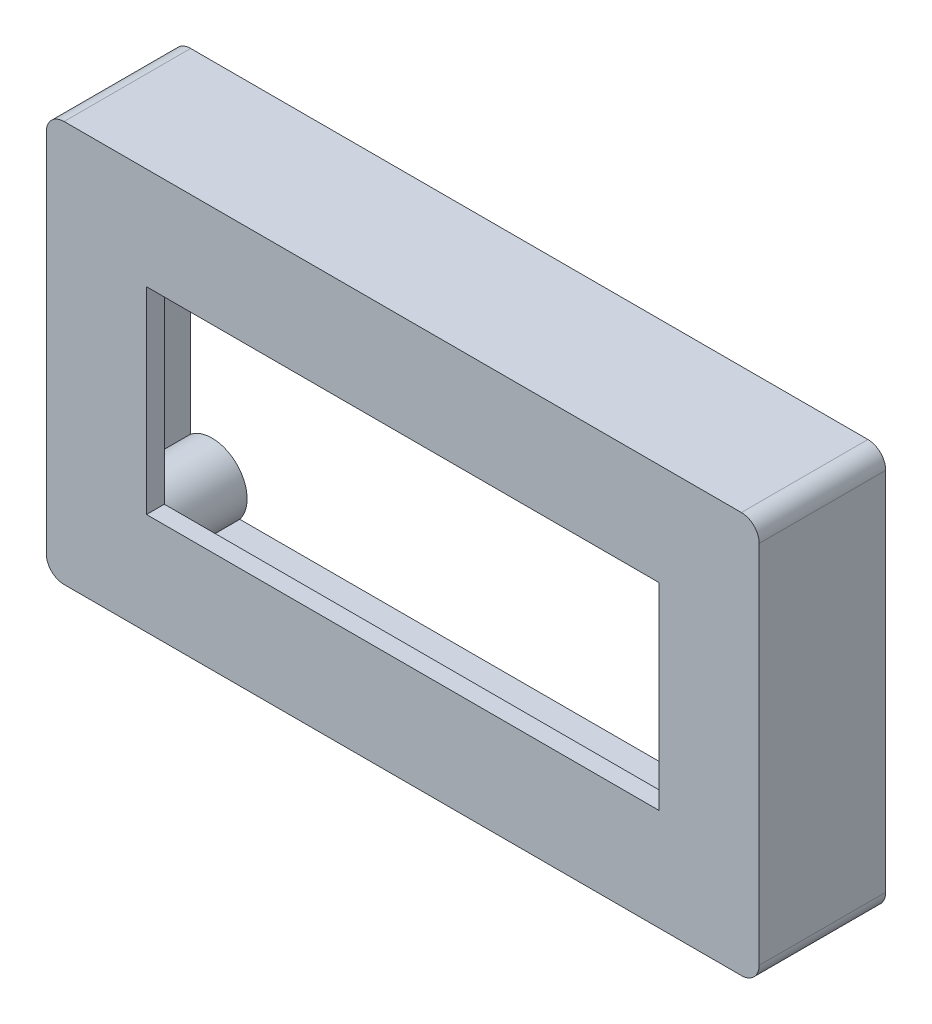
ISO-10303-21;
HEADER;
FILE_DESCRIPTION(('STEP AP214'),'2;1');
FILE_NAME('part.step','',(''),(''),'','','');
FILE_SCHEMA(('AUTOMOTIVE_DESIGN { 1 0 10303 214 1 1 1 1 }'));
ENDSEC;
DATA;
#1=APPLICATION_CONTEXT('core data for automotive mechanical design processes');
#2=APPLICATION_PROTOCOL_DEFINITION('international standard','automotive_design',2000,#1);
#3=PRODUCT_CONTEXT('',#1,'mechanical');
#4=PRODUCT('Part','Part','',(#3));
#5=PRODUCT_RELATED_PRODUCT_CATEGORY('part','',(#4));
#6=PRODUCT_DEFINITION_FORMATION('','',#4);
#7=PRODUCT_DEFINITION_CONTEXT('part definition',#1,'design');
#8=PRODUCT_DEFINITION('design','',#6,#7);
#9=PRODUCT_DEFINITION_SHAPE('','',#8);
#10=(LENGTH_UNIT() NAMED_UNIT(*) SI_UNIT(.MILLI.,.METRE.));
#11=(NAMED_UNIT(*) PLANE_ANGLE_UNIT() SI_UNIT($,.RADIAN.));
#12=(NAMED_UNIT(*) SI_UNIT($,.STERADIAN.) SOLID_ANGLE_UNIT());
#13=UNCERTAINTY_MEASURE_WITH_UNIT(LENGTH_MEASURE(1.E-05),#10,'distance_accuracy_value','');
#14=(GEOMETRIC_REPRESENTATION_CONTEXT(3) GLOBAL_UNCERTAINTY_ASSIGNED_CONTEXT((#13)) GLOBAL_UNIT_ASSIGNED_CONTEXT((#10,
#11,#12)) REPRESENTATION_CONTEXT('',''));
#15=CARTESIAN_POINT('',(0.,0.,0.));
#16=DIRECTION('',(0.,0.,1.));
#17=DIRECTION('',(1.,0.,0.));
#18=AXIS2_PLACEMENT_3D('',#15,#16,#17);
#19=CARTESIAN_POINT('',(-48.26,26.035,15.494));
#20=DIRECTION('',(1.,0.,0.));
#21=DIRECTION('',(0.,1.,0.));
#22=AXIS2_PLACEMENT_3D('',#19,#20,#21);
#23=PLANE('',#22);
#24=DIRECTION('',(0.,-1.,0.));
#25=VECTOR('',#24,1.);
#26=CARTESIAN_POINT('',(-48.26,26.035,15.494));
#27=LINE('',#26,#25);
#28=CARTESIAN_POINT('',(-48.26,19.0234541127924,15.494));
#29=VERTEX_POINT('',#28);
#30=CARTESIAN_POINT('',(-48.26,-19.0234541127924,15.494));
#31=VERTEX_POINT('',#30);
#32=EDGE_CURVE('E190',#29,#31,#27,.T.);
#33=ORIENTED_EDGE('',*,*,#32,.T.);
#34=DIRECTION('',(0.,0.,1.));
#35=VECTOR('',#34,1.);
#36=CARTESIAN_POINT('',(-48.26,-19.0234541127924,-14.1421356237309));
#37=LINE('',#36,#35);
#38=CARTESIAN_POINT('',(-48.26,-19.0234541127924,0.));
#39=VERTEX_POINT('',#38);
#40=EDGE_CURVE('E199',#31,#39,#37,.F.);
#41=ORIENTED_EDGE('',*,*,#40,.T.);
#42=DIRECTION('',(0.,-1.,0.));
#43=VECTOR('',#42,1.);
#44=CARTESIAN_POINT('',(-48.26,26.035,0.));
#45=LINE('',#44,#43);
#46=CARTESIAN_POINT('',(-48.26,19.0234541127924,0.));
#47=VERTEX_POINT('',#46);
#48=EDGE_CURVE('E287',#47,#39,#45,.T.);
#49=ORIENTED_EDGE('',*,*,#48,.F.);
#50=DIRECTION('',(0.,0.,1.));
#51=VECTOR('',#50,1.);
#52=CARTESIAN_POINT('',(-48.26,19.0234541127924,-14.1421356237309));
#53=LINE('',#52,#51);
#54=EDGE_CURVE('E223',#29,#47,#53,.F.);
#55=ORIENTED_EDGE('',*,*,#54,.F.);
#56=EDGE_LOOP('',(#33,#41,#49,#55));
#57=FACE_BOUND('',#56,.T.);
#58=ADVANCED_FACE('F38',(#57),#23,.T.);
#59=CARTESIAN_POINT('',(-48.26,-26.035,15.494));
#60=DIRECTION('',(0.,1.,0.));
#61=DIRECTION('',(0.,0.,1.));
#62=AXIS2_PLACEMENT_3D('',#59,#60,#61);
#63=PLANE('',#62);
#64=DIRECTION('',(1.,0.,0.));
#65=VECTOR('',#64,1.);
#66=CARTESIAN_POINT('',(-48.26,-26.035,0.));
#67=LINE('',#66,#65);
#68=CARTESIAN_POINT('',(-41.2484541127925,-26.035,0.));
#69=VERTEX_POINT('',#68);
#70=CARTESIAN_POINT('',(41.2484541127925,-26.035,0.));
#71=VERTEX_POINT('',#70);
#72=EDGE_CURVE('E195',#69,#71,#67,.T.);
#73=ORIENTED_EDGE('',*,*,#72,.F.);
#74=DIRECTION('',(0.,0.,1.));
#75=VECTOR('',#74,1.);
#76=CARTESIAN_POINT('',(-41.2484541127925,-26.035,-14.1421356237309));
#77=LINE('',#76,#75);
#78=CARTESIAN_POINT('',(-41.2484541127925,-26.035,15.494));
#79=VERTEX_POINT('',#78);
#80=EDGE_CURVE('E193',#69,#79,#77,.T.);
#81=ORIENTED_EDGE('',*,*,#80,.T.);
#82=DIRECTION('',(1.,0.,0.));
#83=VECTOR('',#82,1.);
#84=CARTESIAN_POINT('',(-48.26,-26.035,15.494));
#85=LINE('',#84,#83);
#86=CARTESIAN_POINT('',(41.2484541127925,-26.035,15.494));
#87=VERTEX_POINT('',#86);
#88=EDGE_CURVE('E176',#79,#87,#85,.T.);
#89=ORIENTED_EDGE('',*,*,#88,.T.);
#90=DIRECTION('',(0.,0.,1.));
#91=VECTOR('',#90,1.);
#92=CARTESIAN_POINT('',(41.2484541127925,-26.035,-14.1421356237309));
#93=LINE('',#92,#91);
#94=EDGE_CURVE('E213',#71,#87,#93,.T.);
#95=ORIENTED_EDGE('',*,*,#94,.F.);
#96=EDGE_LOOP('',(#73,#81,#89,#95));
#97=FACE_BOUND('',#96,.T.);
#98=ADVANCED_FACE('F194',(#97),#63,.T.);
#99=CARTESIAN_POINT('',(-48.26,26.035,15.494));
#100=DIRECTION('',(0.,-1.,0.));
#101=DIRECTION('',(0.,0.,-1.));
#102=AXIS2_PLACEMENT_3D('',#99,#100,#101);
#103=PLANE('',#102);
#104=DIRECTION('',(0.,0.,1.));
#105=VECTOR('',#104,1.);
#106=CARTESIAN_POINT('',(-41.2484541127925,26.035,-14.1421356237309));
#107=LINE('',#106,#105);
#108=CARTESIAN_POINT('',(-41.2484541127925,26.035,0.));
#109=VERTEX_POINT('',#108);
#110=CARTESIAN_POINT('',(-41.2484541127925,26.035,15.494));
#111=VERTEX_POINT('',#110);
#112=EDGE_CURVE('E225',#109,#111,#107,.T.);
#113=ORIENTED_EDGE('',*,*,#112,.F.);
#114=DIRECTION('',(-1.,0.,0.));
#115=VECTOR('',#114,1.);
#116=CARTESIAN_POINT('',(-48.26,26.035,0.));
#117=LINE('',#116,#115);
#118=CARTESIAN_POINT('',(41.2484541127924,26.035,0.));
#119=VERTEX_POINT('',#118);
#120=EDGE_CURVE('E277',#119,#109,#117,.T.);
#121=ORIENTED_EDGE('',*,*,#120,.F.);
#122=DIRECTION('',(0.,0.,1.));
#123=VECTOR('',#122,1.);
#124=CARTESIAN_POINT('',(41.2484541127925,26.035,-14.1421356237309));
#125=LINE('',#124,#123);
#126=CARTESIAN_POINT('',(41.2484541127925,26.035,15.494));
#127=VERTEX_POINT('',#126);
#128=EDGE_CURVE('E233',#119,#127,#125,.T.);
#129=ORIENTED_EDGE('',*,*,#128,.T.);
#130=DIRECTION('',(-1.,0.,0.));
#131=VECTOR('',#130,1.);
#132=CARTESIAN_POINT('',(-48.26,26.035,15.494));
#133=LINE('',#132,#131);
#134=EDGE_CURVE('E278',#127,#111,#133,.T.);
#135=ORIENTED_EDGE('',*,*,#134,.T.);
#136=EDGE_LOOP('',(#113,#121,#129,#135));
#137=FACE_BOUND('',#136,.T.);
#138=ADVANCED_FACE('F381',(#137),#103,.T.);
#139=CARTESIAN_POINT('',(48.26,26.035,15.494));
#140=DIRECTION('',(-1.,0.,0.));
#141=DIRECTION('',(0.,-1.,0.));
#142=AXIS2_PLACEMENT_3D('',#139,#140,#141);
#143=PLANE('',#142);
#144=DIRECTION('',(0.,0.,1.));
#145=VECTOR('',#144,1.);
#146=CARTESIAN_POINT('',(48.26,-19.0234541127924,-14.1421356237309));
#147=LINE('',#146,#145);
#148=CARTESIAN_POINT('',(48.26,-19.0234541127924,15.494));
#149=VERTEX_POINT('',#148);
#150=CARTESIAN_POINT('',(48.26,-19.0234541127924,0.));
#151=VERTEX_POINT('',#150);
#152=EDGE_CURVE('E215',#149,#151,#147,.F.);
#153=ORIENTED_EDGE('',*,*,#152,.F.);
#154=DIRECTION('',(0.,1.,0.));
#155=VECTOR('',#154,1.);
#156=CARTESIAN_POINT('',(48.26,26.035,15.494));
#157=LINE('',#156,#155);
#158=CARTESIAN_POINT('',(48.26,19.0234541127924,15.494));
#159=VERTEX_POINT('',#158);
#160=EDGE_CURVE('E189',#149,#159,#157,.T.);
#161=ORIENTED_EDGE('',*,*,#160,.T.);
#162=DIRECTION('',(0.,0.,1.));
#163=VECTOR('',#162,1.);
#164=CARTESIAN_POINT('',(48.26,19.0234541127924,-14.1421356237309));
#165=LINE('',#164,#163);
#166=CARTESIAN_POINT('',(48.26,19.0234541127924,0.));
#167=VERTEX_POINT('',#166);
#168=EDGE_CURVE('E230',#159,#167,#165,.F.);
#169=ORIENTED_EDGE('',*,*,#168,.T.);
#170=DIRECTION('',(0.,1.,0.));
#171=VECTOR('',#170,1.);
#172=CARTESIAN_POINT('',(48.26,26.035,0.));
#173=LINE('',#172,#171);
#174=EDGE_CURVE('E281',#151,#167,#173,.T.);
#175=ORIENTED_EDGE('',*,*,#174,.F.);
#176=EDGE_LOOP('',(#153,#161,#169,#175));
#177=FACE_BOUND('',#176,.T.);
#178=ADVANCED_FACE('F387',(#177),#143,.T.);
#179=CARTESIAN_POINT('',(0.,0.,0.));
#180=DIRECTION('',(0.,0.,1.));
#181=DIRECTION('',(1.,0.,0.));
#182=AXIS2_PLACEMENT_3D('',#179,#180,#181);
#183=PLANE('',#182);
#184=CARTESIAN_POINT('',(45.212,-22.987,0.));
#185=DIRECTION('',(0.,0.,1.));
#186=DIRECTION('',(1.,0.,0.));
#187=AXIS2_PLACEMENT_3D('',#184,#185,#186);
#188=CIRCLE('',#187,2.79399999999999);
#189=CARTESIAN_POINT('',(48.006,-22.987,0.));
#190=VERTEX_POINT('',#189);
#191=EDGE_CURVE('E876',#190,#190,#188,.T.);
#192=ORIENTED_EDGE('',*,*,#191,.T.);
#193=EDGE_LOOP('',(#192));
#194=FACE_BOUND('',#193,.T.);
#195=CARTESIAN_POINT('',(-45.212,22.987,0.));
#196=DIRECTION('',(0.,0.,1.));
#197=DIRECTION('',(1.,0.,0.));
#198=AXIS2_PLACEMENT_3D('',#195,#196,#197);
#199=CIRCLE('',#198,2.794);
#200=CARTESIAN_POINT('',(-42.418,22.987,0.));
#201=VERTEX_POINT('',#200);
#202=EDGE_CURVE('E870',#201,#201,#199,.T.);
#203=ORIENTED_EDGE('',*,*,#202,.T.);
#204=EDGE_LOOP('',(#203));
#205=FACE_BOUND('',#204,.T.);
#206=CARTESIAN_POINT('',(-45.212,-22.987,0.));
#207=DIRECTION('',(0.,0.,1.));
#208=DIRECTION('',(1.,0.,0.));
#209=AXIS2_PLACEMENT_3D('',#206,#207,#208);
#210=CIRCLE('',#209,2.794);
#211=CARTESIAN_POINT('',(-42.418,-22.987,0.));
#212=VERTEX_POINT('',#211);
#213=EDGE_CURVE('E864',#212,#212,#210,.T.);
#214=ORIENTED_EDGE('',*,*,#213,.T.);
#215=EDGE_LOOP('',(#214));
#216=FACE_BOUND('',#215,.T.);
#217=CARTESIAN_POINT('',(45.212,22.987,0.));
#218=DIRECTION('',(0.,0.,1.));
#219=DIRECTION('',(1.,0.,0.));
#220=AXIS2_PLACEMENT_3D('',#217,#218,#219);
#221=CIRCLE('',#220,2.8);
#222=CARTESIAN_POINT('',(48.012,22.987,0.));
#223=VERTEX_POINT('',#222);
#224=EDGE_CURVE('E850',#223,#223,#221,.T.);
#225=ORIENTED_EDGE('',*,*,#224,.T.);
#226=EDGE_LOOP('',(#225));
#227=FACE_BOUND('',#226,.T.);
#228=ORIENTED_EDGE('',*,*,#48,.T.);
#229=CARTESIAN_POINT('',(-45.212,-22.987,0.));
#230=DIRECTION('',(0.,0.,1.));
#231=DIRECTION('',(1.,0.,0.));
#232=AXIS2_PLACEMENT_3D('',#229,#230,#231);
#233=CIRCLE('',#232,5.);
#234=EDGE_CURVE('E203',#69,#39,#233,.T.);
#235=ORIENTED_EDGE('',*,*,#234,.F.);
#236=ORIENTED_EDGE('',*,*,#72,.T.);
#237=CARTESIAN_POINT('',(45.212,-22.987,0.));
#238=DIRECTION('',(0.,0.,1.));
#239=DIRECTION('',(1.,0.,0.));
#240=AXIS2_PLACEMENT_3D('',#237,#238,#239);
#241=CIRCLE('',#240,5.);
#242=EDGE_CURVE('E210',#71,#151,#241,.F.);
#243=ORIENTED_EDGE('',*,*,#242,.T.);
#244=ORIENTED_EDGE('',*,*,#174,.T.);
#245=CARTESIAN_POINT('',(45.212,22.987,0.));
#246=DIRECTION('',(0.,0.,1.));
#247=DIRECTION('',(1.,0.,0.));
#248=AXIS2_PLACEMENT_3D('',#245,#246,#247);
#249=CIRCLE('',#248,5.);
#250=EDGE_CURVE('E227',#119,#167,#249,.T.);
#251=ORIENTED_EDGE('',*,*,#250,.F.);
#252=ORIENTED_EDGE('',*,*,#120,.T.);
#253=CARTESIAN_POINT('',(-45.212,22.987,0.));
#254=DIRECTION('',(0.,0.,1.));
#255=DIRECTION('',(1.,0.,0.));
#256=AXIS2_PLACEMENT_3D('',#253,#254,#255);
#257=CIRCLE('',#256,5.);
#258=EDGE_CURVE('E217',#109,#47,#257,.F.);
#259=ORIENTED_EDGE('',*,*,#258,.T.);
#260=EDGE_LOOP('',(#228,#235,#236,#243,#244,#251,#252,#259));
#261=FACE_BOUND('',#260,.T.);
#262=DIRECTION('',(0.,1.,0.));
#263=VECTOR('',#262,1.);
#264=CARTESIAN_POINT('',(50.8,28.575,0.));
#265=LINE('',#264,#263);
#266=CARTESIAN_POINT('',(50.8,-26.035,0.));
#267=VERTEX_POINT('',#266);
#268=CARTESIAN_POINT('',(50.8,26.035,0.));
#269=VERTEX_POINT('',#268);
#270=EDGE_CURVE('E297',#267,#269,#265,.T.);
#271=ORIENTED_EDGE('',*,*,#270,.F.);
#272=CARTESIAN_POINT('',(48.26,-26.035,0.));
#273=DIRECTION('',(0.,0.,1.));
#274=DIRECTION('',(1.,0.,0.));
#275=AXIS2_PLACEMENT_3D('',#272,#273,#274);
#276=CIRCLE('',#275,2.54);
#277=CARTESIAN_POINT('',(48.26,-28.575,0.));
#278=VERTEX_POINT('',#277);
#279=EDGE_CURVE('E317',#267,#278,#276,.F.);
#280=ORIENTED_EDGE('',*,*,#279,.T.);
#281=DIRECTION('',(1.,0.,0.));
#282=VECTOR('',#281,1.);
#283=CARTESIAN_POINT('',(-50.8,-28.575,0.));
#284=LINE('',#283,#282);
#285=CARTESIAN_POINT('',(-48.26,-28.575,0.));
#286=VERTEX_POINT('',#285);
#287=EDGE_CURVE('E294',#286,#278,#284,.T.);
#288=ORIENTED_EDGE('',*,*,#287,.F.);
#289=CARTESIAN_POINT('',(-48.26,-26.035,0.));
#290=DIRECTION('',(0.,0.,1.));
#291=DIRECTION('',(1.,0.,0.));
#292=AXIS2_PLACEMENT_3D('',#289,#290,#291);
#293=CIRCLE('',#292,2.54);
#294=CARTESIAN_POINT('',(-50.8,-26.035,0.));
#295=VERTEX_POINT('',#294);
#296=EDGE_CURVE('E311',#286,#295,#293,.F.);
#297=ORIENTED_EDGE('',*,*,#296,.T.);
#298=DIRECTION('',(0.,-1.,0.));
#299=VECTOR('',#298,1.);
#300=CARTESIAN_POINT('',(-50.8,28.575,0.));
#301=LINE('',#300,#299);
#302=CARTESIAN_POINT('',(-50.8,26.035,0.));
#303=VERTEX_POINT('',#302);
#304=EDGE_CURVE('E284',#303,#295,#301,.T.);
#305=ORIENTED_EDGE('',*,*,#304,.F.);
#306=CARTESIAN_POINT('',(-48.26,26.035,0.));
#307=DIRECTION('',(0.,0.,1.));
#308=DIRECTION('',(1.,0.,0.));
#309=AXIS2_PLACEMENT_3D('',#306,#307,#308);
#310=CIRCLE('',#309,2.54);
#311=CARTESIAN_POINT('',(-48.26,28.575,0.));
#312=VERTEX_POINT('',#311);
#313=EDGE_CURVE('E313',#303,#312,#310,.F.);
#314=ORIENTED_EDGE('',*,*,#313,.T.);
#315=DIRECTION('',(-1.,0.,0.));
#316=VECTOR('',#315,1.);
#317=CARTESIAN_POINT('',(-50.8,28.575,0.));
#318=LINE('',#317,#316);
#319=CARTESIAN_POINT('',(48.26,28.575,0.));
#320=VERTEX_POINT('',#319);
#321=EDGE_CURVE('E300',#320,#312,#318,.T.);
#322=ORIENTED_EDGE('',*,*,#321,.F.);
#323=CARTESIAN_POINT('',(48.26,26.035,0.));
#324=DIRECTION('',(0.,0.,1.));
#325=DIRECTION('',(1.,0.,0.));
#326=AXIS2_PLACEMENT_3D('',#323,#324,#325);
#327=CIRCLE('',#326,2.54);
#328=EDGE_CURVE('E315',#320,#269,#327,.F.);
#329=ORIENTED_EDGE('',*,*,#328,.T.);
#330=EDGE_LOOP('',(#271,#280,#288,#297,#305,#314,#322,#329));
#331=FACE_BOUND('',#330,.T.);
#332=ADVANCED_FACE('F353',(#194,#205,#216,#227,#261,#331),#183,.F.);
#333=CARTESIAN_POINT('',(-50.8,28.575,15.494));
#334=DIRECTION('',(1.,0.,0.));
#335=DIRECTION('',(0.,1.,0.));
#336=AXIS2_PLACEMENT_3D('',#333,#334,#335);
#337=PLANE('',#336);
#338=DIRECTION('',(0.,-1.,0.));
#339=VECTOR('',#338,1.);
#340=CARTESIAN_POINT('',(-50.8,28.575,18.034));
#341=LINE('',#340,#339);
#342=CARTESIAN_POINT('',(-50.8,26.035,18.034));
#343=VERTEX_POINT('',#342);
#344=CARTESIAN_POINT('',(-50.8,-26.035,18.034));
#345=VERTEX_POINT('',#344);
#346=EDGE_CURVE('E267',#343,#345,#341,.T.);
#347=ORIENTED_EDGE('',*,*,#346,.F.);
#348=DIRECTION('',(0.,0.,-1.));
#349=VECTOR('',#348,1.);
#350=CARTESIAN_POINT('',(-50.8,26.035,15.494));
#351=LINE('',#350,#349);
#352=EDGE_CURVE('E13',#343,#303,#351,.T.);
#353=ORIENTED_EDGE('',*,*,#352,.T.);
#354=ORIENTED_EDGE('',*,*,#304,.T.);
#355=DIRECTION('',(0.,0.,-1.));
#356=VECTOR('',#355,1.);
#357=CARTESIAN_POINT('',(-50.8,-26.035,15.494));
#358=LINE('',#357,#356);
#359=EDGE_CURVE('E46',#295,#345,#358,.F.);
#360=ORIENTED_EDGE('',*,*,#359,.T.);
#361=EDGE_LOOP('',(#347,#353,#354,#360));
#362=FACE_BOUND('',#361,.T.);
#363=ADVANCED_FACE('F337',(#362),#337,.F.);
#364=CARTESIAN_POINT('',(-50.8,-28.575,15.494));
#365=DIRECTION('',(0.,1.,0.));
#366=DIRECTION('',(0.,0.,1.));
#367=AXIS2_PLACEMENT_3D('',#364,#365,#366);
#368=PLANE('',#367);
#369=ORIENTED_EDGE('',*,*,#287,.T.);
#370=DIRECTION('',(0.,0.,-1.));
#371=VECTOR('',#370,1.);
#372=CARTESIAN_POINT('',(48.26,-28.575,15.494));
#373=LINE('',#372,#371);
#374=CARTESIAN_POINT('',(48.26,-28.575,18.034));
#375=VERTEX_POINT('',#374);
#376=EDGE_CURVE('E322',#278,#375,#373,.F.);
#377=ORIENTED_EDGE('',*,*,#376,.T.);
#378=DIRECTION('',(1.,0.,0.));
#379=VECTOR('',#378,1.);
#380=CARTESIAN_POINT('',(-50.8,-28.575,18.034));
#381=LINE('',#380,#379);
#382=CARTESIAN_POINT('',(-48.26,-28.575,18.034));
#383=VERTEX_POINT('',#382);
#384=EDGE_CURVE('E270',#383,#375,#381,.T.);
#385=ORIENTED_EDGE('',*,*,#384,.F.);
#386=DIRECTION('',(0.,0.,-1.));
#387=VECTOR('',#386,1.);
#388=CARTESIAN_POINT('',(-48.26,-28.575,15.494));
#389=LINE('',#388,#387);
#390=EDGE_CURVE('E319',#383,#286,#389,.T.);
#391=ORIENTED_EDGE('',*,*,#390,.T.);
#392=EDGE_LOOP('',(#369,#377,#385,#391));
#393=FACE_BOUND('',#392,.T.);
#394=ADVANCED_FACE('F349',(#393),#368,.F.);
#395=CARTESIAN_POINT('',(50.8,28.575,15.494));
#396=DIRECTION('',(-1.,0.,0.));
#397=DIRECTION('',(0.,0.,1.));
#398=AXIS2_PLACEMENT_3D('',#395,#396,#397);
#399=PLANE('',#398);
#400=DIRECTION('',(0.,1.,0.));
#401=VECTOR('',#400,1.);
#402=CARTESIAN_POINT('',(50.8,28.575,18.034));
#403=LINE('',#402,#401);
#404=CARTESIAN_POINT('',(50.8,-26.035,18.034));
#405=VERTEX_POINT('',#404);
#406=CARTESIAN_POINT('',(50.8,26.035,18.034));
#407=VERTEX_POINT('',#406);
#408=EDGE_CURVE('E273',#405,#407,#403,.T.);
#409=ORIENTED_EDGE('',*,*,#408,.F.);
#410=DIRECTION('',(0.,0.,-1.));
#411=VECTOR('',#410,1.);
#412=CARTESIAN_POINT('',(50.8,-26.035,15.494));
#413=LINE('',#412,#411);
#414=EDGE_CURVE('E308',#405,#267,#413,.T.);
#415=ORIENTED_EDGE('',*,*,#414,.T.);
#416=ORIENTED_EDGE('',*,*,#270,.T.);
#417=DIRECTION('',(0.,0.,-1.));
#418=VECTOR('',#417,1.);
#419=CARTESIAN_POINT('',(50.8,26.035,15.494));
#420=LINE('',#419,#418);
#421=EDGE_CURVE('E306',#269,#407,#420,.F.);
#422=ORIENTED_EDGE('',*,*,#421,.T.);
#423=EDGE_LOOP('',(#409,#415,#416,#422));
#424=FACE_BOUND('',#423,.T.);
#425=ADVANCED_FACE('F360',(#424),#399,.F.);
#426=CARTESIAN_POINT('',(-50.8,28.575,15.494));
#427=DIRECTION('',(0.,-1.,0.));
#428=DIRECTION('',(0.,0.,-1.));
#429=AXIS2_PLACEMENT_3D('',#426,#427,#428);
#430=PLANE('',#429);
#431=DIRECTION('',(-1.,0.,0.));
#432=VECTOR('',#431,1.);
#433=CARTESIAN_POINT('',(-50.8,28.575,18.034));
#434=LINE('',#433,#432);
#435=CARTESIAN_POINT('',(48.26,28.575,18.034));
#436=VERTEX_POINT('',#435);
#437=CARTESIAN_POINT('',(-48.26,28.575,18.034));
#438=VERTEX_POINT('',#437);
#439=EDGE_CURVE('E275',#436,#438,#434,.T.);
#440=ORIENTED_EDGE('',*,*,#439,.F.);
#441=DIRECTION('',(0.,0.,-1.));
#442=VECTOR('',#441,1.);
#443=CARTESIAN_POINT('',(48.26,28.575,15.494));
#444=LINE('',#443,#442);
#445=EDGE_CURVE('E332',#436,#320,#444,.T.);
#446=ORIENTED_EDGE('',*,*,#445,.T.);
#447=ORIENTED_EDGE('',*,*,#321,.T.);
#448=DIRECTION('',(0.,0.,-1.));
#449=VECTOR('',#448,1.);
#450=CARTESIAN_POINT('',(-48.26,28.575,15.494));
#451=LINE('',#450,#449);
#452=EDGE_CURVE('E53',#312,#438,#451,.F.);
#453=ORIENTED_EDGE('',*,*,#452,.T.);
#454=EDGE_LOOP('',(#440,#446,#447,#453));
#455=FACE_BOUND('',#454,.T.);
#456=ADVANCED_FACE('F366',(#455),#430,.F.);
#457=CARTESIAN_POINT('',(0.,0.,18.034));
#458=DIRECTION('',(0.,0.,1.));
#459=DIRECTION('',(1.,0.,0.));
#460=AXIS2_PLACEMENT_3D('',#457,#458,#459);
#461=PLANE('',#460);
#462=ORIENTED_EDGE('',*,*,#384,.T.);
#463=CARTESIAN_POINT('',(48.26,-26.035,18.034));
#464=DIRECTION('',(0.,0.,1.));
#465=DIRECTION('',(1.,0.,0.));
#466=AXIS2_PLACEMENT_3D('',#463,#464,#465);
#467=CIRCLE('',#466,2.54);
#468=EDGE_CURVE('E329',#375,#405,#467,.T.);
#469=ORIENTED_EDGE('',*,*,#468,.T.);
#470=ORIENTED_EDGE('',*,*,#408,.T.);
#471=CARTESIAN_POINT('',(48.26,26.035,18.034));
#472=DIRECTION('',(0.,0.,1.));
#473=DIRECTION('',(1.,0.,0.));
#474=AXIS2_PLACEMENT_3D('',#471,#472,#473);
#475=CIRCLE('',#474,2.54);
#476=EDGE_CURVE('E60',#407,#436,#475,.T.);
#477=ORIENTED_EDGE('',*,*,#476,.T.);
#478=ORIENTED_EDGE('',*,*,#439,.T.);
#479=CARTESIAN_POINT('',(-48.26,26.035,18.034));
#480=DIRECTION('',(0.,0.,1.));
#481=DIRECTION('',(1.,0.,0.));
#482=AXIS2_PLACEMENT_3D('',#479,#480,#481);
#483=CIRCLE('',#482,2.54);
#484=EDGE_CURVE('E326',#438,#343,#483,.T.);
#485=ORIENTED_EDGE('',*,*,#484,.T.);
#486=ORIENTED_EDGE('',*,*,#346,.T.);
#487=CARTESIAN_POINT('',(-48.26,-26.035,18.034));
#488=DIRECTION('',(0.,0.,1.));
#489=DIRECTION('',(1.,0.,0.));
#490=AXIS2_PLACEMENT_3D('',#487,#488,#489);
#491=CIRCLE('',#490,2.54);
#492=EDGE_CURVE('E324',#345,#383,#491,.T.);
#493=ORIENTED_EDGE('',*,*,#492,.T.);
#494=EDGE_LOOP('',(#462,#469,#470,#477,#478,#485,#486,#493));
#495=FACE_BOUND('',#494,.T.);
#496=DIRECTION('',(1.,0.,0.));
#497=VECTOR('',#496,1.);
#498=CARTESIAN_POINT('',(36.5125,-14.0589,18.034));
#499=LINE('',#498,#497);
#500=CARTESIAN_POINT('',(-36.5125,-14.0589,18.034));
#501=VERTEX_POINT('',#500);
#502=CARTESIAN_POINT('',(36.5125,-14.0589,18.034));
#503=VERTEX_POINT('',#502);
#504=EDGE_CURVE('E239',#501,#503,#499,.T.);
#505=ORIENTED_EDGE('',*,*,#504,.F.);
#506=DIRECTION('',(0.,-1.,0.));
#507=VECTOR('',#506,1.);
#508=CARTESIAN_POINT('',(-36.5125,-14.0589,18.034));
#509=LINE('',#508,#507);
#510=CARTESIAN_POINT('',(-36.5125,14.0589,18.034));
#511=VERTEX_POINT('',#510);
#512=EDGE_CURVE('E237',#511,#501,#509,.T.);
#513=ORIENTED_EDGE('',*,*,#512,.F.);
#514=DIRECTION('',(-1.,0.,0.));
#515=VECTOR('',#514,1.);
#516=CARTESIAN_POINT('',(36.5125,14.0589,18.034));
#517=LINE('',#516,#515);
#518=CARTESIAN_POINT('',(36.5125,14.0589,18.034));
#519=VERTEX_POINT('',#518);
#520=EDGE_CURVE('E245',#519,#511,#517,.T.);
#521=ORIENTED_EDGE('',*,*,#520,.F.);
#522=DIRECTION('',(0.,1.,0.));
#523=VECTOR('',#522,1.);
#524=CARTESIAN_POINT('',(36.5125,-14.0589,18.034));
#525=LINE('',#524,#523);
#526=EDGE_CURVE('E242',#503,#519,#525,.T.);
#527=ORIENTED_EDGE('',*,*,#526,.F.);
#528=EDGE_LOOP('',(#505,#513,#521,#527));
#529=FACE_BOUND('',#528,.T.);
#530=ADVANCED_FACE('F342',(#495,#529),#461,.T.);
#531=CARTESIAN_POINT('',(0.,0.,15.494));
#532=DIRECTION('',(0.,0.,1.));
#533=DIRECTION('',(1.,0.,0.));
#534=AXIS2_PLACEMENT_3D('',#531,#532,#533);
#535=PLANE('',#534);
#536=CARTESIAN_POINT('',(-45.212,-22.987,15.494));
#537=DIRECTION('',(0.,0.,-1.));
#538=DIRECTION('',(-1.,0.,0.));
#539=AXIS2_PLACEMENT_3D('',#536,#537,#538);
#540=CIRCLE('',#539,5.);
#541=EDGE_CURVE('E182',#31,#79,#540,.T.);
#542=ORIENTED_EDGE('',*,*,#541,.F.);
#543=ORIENTED_EDGE('',*,*,#32,.F.);
#544=CARTESIAN_POINT('',(-45.212,22.987,15.494));
#545=DIRECTION('',(0.,0.,-1.));
#546=DIRECTION('',(-1.,0.,0.));
#547=AXIS2_PLACEMENT_3D('',#544,#545,#546);
#548=CIRCLE('',#547,5.);
#549=EDGE_CURVE('E220',#29,#111,#548,.F.);
#550=ORIENTED_EDGE('',*,*,#549,.T.);
#551=ORIENTED_EDGE('',*,*,#134,.F.);
#552=CARTESIAN_POINT('',(45.212,22.987,15.494));
#553=DIRECTION('',(0.,0.,1.));
#554=DIRECTION('',(1.,0.,0.));
#555=AXIS2_PLACEMENT_3D('',#552,#553,#554);
#556=CIRCLE('',#555,5.);
#557=EDGE_CURVE('E302',#159,#127,#556,.F.);
#558=ORIENTED_EDGE('',*,*,#557,.F.);
#559=ORIENTED_EDGE('',*,*,#160,.F.);
#560=CARTESIAN_POINT('',(45.212,-22.987,15.494));
#561=DIRECTION('',(0.,0.,1.));
#562=DIRECTION('',(1.,0.,0.));
#563=AXIS2_PLACEMENT_3D('',#560,#561,#562);
#564=CIRCLE('',#563,5.);
#565=EDGE_CURVE('E185',#149,#87,#564,.T.);
#566=ORIENTED_EDGE('',*,*,#565,.T.);
#567=ORIENTED_EDGE('',*,*,#88,.F.);
#568=EDGE_LOOP('',(#542,#543,#550,#551,#558,#559,#566,#567));
#569=FACE_BOUND('',#568,.T.);
#570=DIRECTION('',(0.,-1.,0.));
#571=VECTOR('',#570,1.);
#572=CARTESIAN_POINT('',(-36.5125,-14.0589,15.494));
#573=LINE('',#572,#571);
#574=CARTESIAN_POINT('',(-36.5125,14.0589,15.494));
#575=VERTEX_POINT('',#574);
#576=CARTESIAN_POINT('',(-36.5125,-14.0589,15.494));
#577=VERTEX_POINT('',#576);
#578=EDGE_CURVE('E236',#575,#577,#573,.T.);
#579=ORIENTED_EDGE('',*,*,#578,.T.);
#580=DIRECTION('',(1.,0.,0.));
#581=VECTOR('',#580,1.);
#582=CARTESIAN_POINT('',(36.5125,-14.0589,15.494));
#583=LINE('',#582,#581);
#584=CARTESIAN_POINT('',(36.5125,-14.0589,15.494));
#585=VERTEX_POINT('',#584);
#586=EDGE_CURVE('E250',#577,#585,#583,.T.);
#587=ORIENTED_EDGE('',*,*,#586,.T.);
#588=DIRECTION('',(0.,1.,0.));
#589=VECTOR('',#588,1.);
#590=CARTESIAN_POINT('',(36.5125,-14.0589,15.494));
#591=LINE('',#590,#589);
#592=CARTESIAN_POINT('',(36.5125,14.0589,15.494));
#593=VERTEX_POINT('',#592);
#594=EDGE_CURVE('E253',#585,#593,#591,.T.);
#595=ORIENTED_EDGE('',*,*,#594,.T.);
#596=DIRECTION('',(-1.,0.,0.));
#597=VECTOR('',#596,1.);
#598=CARTESIAN_POINT('',(36.5125,14.0589,15.494));
#599=LINE('',#598,#597);
#600=EDGE_CURVE('E240',#593,#575,#599,.T.);
#601=ORIENTED_EDGE('',*,*,#600,.T.);
#602=EDGE_LOOP('',(#579,#587,#595,#601));
#603=FACE_BOUND('',#602,.T.);
#604=ADVANCED_FACE('F178',(#569,#603),#535,.F.);
#605=CARTESIAN_POINT('',(-36.5125,-14.0589,18.034));
#606=DIRECTION('',(1.,0.,0.));
#607=DIRECTION('',(0.,0.,-1.));
#608=AXIS2_PLACEMENT_3D('',#605,#606,#607);
#609=PLANE('',#608);
#610=ORIENTED_EDGE('',*,*,#578,.F.);
#611=DIRECTION('',(0.,0.,-1.));
#612=VECTOR('',#611,1.);
#613=CARTESIAN_POINT('',(-36.5125,14.0589,18.034));
#614=LINE('',#613,#612);
#615=EDGE_CURVE('E247',#511,#575,#614,.T.);
#616=ORIENTED_EDGE('',*,*,#615,.F.);
#617=ORIENTED_EDGE('',*,*,#512,.T.);
#618=DIRECTION('',(0.,0.,-1.));
#619=VECTOR('',#618,1.);
#620=CARTESIAN_POINT('',(-36.5125,-14.0589,18.034));
#621=LINE('',#620,#619);
#622=EDGE_CURVE('E264',#501,#577,#621,.T.);
#623=ORIENTED_EDGE('',*,*,#622,.T.);
#624=EDGE_LOOP('',(#610,#616,#617,#623));
#625=FACE_BOUND('',#624,.T.);
#626=ADVANCED_FACE('F474',(#625),#609,.T.);
#627=CARTESIAN_POINT('',(36.5125,-14.0589,18.034));
#628=DIRECTION('',(0.,1.,0.));
#629=DIRECTION('',(0.,0.,1.));
#630=AXIS2_PLACEMENT_3D('',#627,#628,#629);
#631=PLANE('',#630);
#632=ORIENTED_EDGE('',*,*,#586,.F.);
#633=ORIENTED_EDGE('',*,*,#622,.F.);
#634=ORIENTED_EDGE('',*,*,#504,.T.);
#635=DIRECTION('',(0.,0.,-1.));
#636=VECTOR('',#635,1.);
#637=CARTESIAN_POINT('',(36.5125,-14.0589,18.034));
#638=LINE('',#637,#636);
#639=EDGE_CURVE('E262',#503,#585,#638,.T.);
#640=ORIENTED_EDGE('',*,*,#639,.T.);
#641=EDGE_LOOP('',(#632,#633,#634,#640));
#642=FACE_BOUND('',#641,.T.);
#643=ADVANCED_FACE('F470',(#642),#631,.T.);
#644=CARTESIAN_POINT('',(36.5125,-14.0589,18.034));
#645=DIRECTION('',(-1.,0.,0.));
#646=DIRECTION('',(0.,0.,1.));
#647=AXIS2_PLACEMENT_3D('',#644,#645,#646);
#648=PLANE('',#647);
#649=ORIENTED_EDGE('',*,*,#594,.F.);
#650=ORIENTED_EDGE('',*,*,#639,.F.);
#651=ORIENTED_EDGE('',*,*,#526,.T.);
#652=DIRECTION('',(0.,0.,-1.));
#653=VECTOR('',#652,1.);
#654=CARTESIAN_POINT('',(36.5125,14.0589,18.034));
#655=LINE('',#654,#653);
#656=EDGE_CURVE('E260',#519,#593,#655,.T.);
#657=ORIENTED_EDGE('',*,*,#656,.T.);
#658=EDGE_LOOP('',(#649,#650,#651,#657));
#659=FACE_BOUND('',#658,.T.);
#660=ADVANCED_FACE('F466',(#659),#648,.T.);
#661=CARTESIAN_POINT('',(36.5125,14.0589,18.034));
#662=DIRECTION('',(0.,-1.,0.));
#663=DIRECTION('',(0.,0.,-1.));
#664=AXIS2_PLACEMENT_3D('',#661,#662,#663);
#665=PLANE('',#664);
#666=ORIENTED_EDGE('',*,*,#600,.F.);
#667=ORIENTED_EDGE('',*,*,#656,.F.);
#668=ORIENTED_EDGE('',*,*,#520,.T.);
#669=ORIENTED_EDGE('',*,*,#615,.T.);
#670=EDGE_LOOP('',(#666,#667,#668,#669));
#671=FACE_BOUND('',#670,.T.);
#672=ADVANCED_FACE('F462',(#671),#665,.T.);
#673=CARTESIAN_POINT('',(45.212,22.987,-14.1421356237309));
#674=DIRECTION('',(0.,0.,1.));
#675=DIRECTION('',(1.,0.,0.));
#676=AXIS2_PLACEMENT_3D('',#673,#674,#675);
#677=CYLINDRICAL_SURFACE('',#676,5.);
#678=ORIENTED_EDGE('',*,*,#128,.F.);
#679=ORIENTED_EDGE('',*,*,#250,.T.);
#680=ORIENTED_EDGE('',*,*,#168,.F.);
#681=ORIENTED_EDGE('',*,*,#557,.T.);
#682=EDGE_LOOP('',(#678,#679,#680,#681));
#683=FACE_BOUND('',#682,.T.);
#684=ADVANCED_FACE('F458',(#683),#677,.T.);
#685=CARTESIAN_POINT('',(-45.212,22.987,-14.1421356237309));
#686=DIRECTION('',(0.,0.,1.));
#687=DIRECTION('',(1.,0.,0.));
#688=AXIS2_PLACEMENT_3D('',#685,#686,#687);
#689=CYLINDRICAL_SURFACE('',#688,5.);
#690=ORIENTED_EDGE('',*,*,#258,.F.);
#691=ORIENTED_EDGE('',*,*,#112,.T.);
#692=ORIENTED_EDGE('',*,*,#549,.F.);
#693=ORIENTED_EDGE('',*,*,#54,.T.);
#694=EDGE_LOOP('',(#690,#691,#692,#693));
#695=FACE_BOUND('',#694,.T.);
#696=ADVANCED_FACE('F454',(#695),#689,.T.);
#697=CARTESIAN_POINT('',(45.212,-22.987,-14.1421356237309));
#698=DIRECTION('',(0.,0.,1.));
#699=DIRECTION('',(1.,0.,0.));
#700=AXIS2_PLACEMENT_3D('',#697,#698,#699);
#701=CYLINDRICAL_SURFACE('',#700,5.);
#702=ORIENTED_EDGE('',*,*,#565,.F.);
#703=ORIENTED_EDGE('',*,*,#152,.T.);
#704=ORIENTED_EDGE('',*,*,#242,.F.);
#705=ORIENTED_EDGE('',*,*,#94,.T.);
#706=EDGE_LOOP('',(#702,#703,#704,#705));
#707=FACE_BOUND('',#706,.T.);
#708=ADVANCED_FACE('F451',(#707),#701,.T.);
#709=CARTESIAN_POINT('',(-45.212,-22.987,-14.1421356237309));
#710=DIRECTION('',(0.,0.,1.));
#711=DIRECTION('',(1.,0.,0.));
#712=AXIS2_PLACEMENT_3D('',#709,#710,#711);
#713=CYLINDRICAL_SURFACE('',#712,5.);
#714=ORIENTED_EDGE('',*,*,#40,.F.);
#715=ORIENTED_EDGE('',*,*,#541,.T.);
#716=ORIENTED_EDGE('',*,*,#80,.F.);
#717=ORIENTED_EDGE('',*,*,#234,.T.);
#718=EDGE_LOOP('',(#714,#715,#716,#717));
#719=FACE_BOUND('',#718,.T.);
#720=ADVANCED_FACE('F202',(#719),#713,.T.);
#721=CARTESIAN_POINT('',(45.212,22.987,0.));
#722=DIRECTION('',(0.,0.,-1.));
#723=DIRECTION('',(-1.,0.,0.));
#724=AXIS2_PLACEMENT_3D('',#721,#722,#723);
#725=CONICAL_SURFACE('',#724,2.8,0.174532925199438);
#726=ORIENTED_EDGE('',*,*,#224,.F.);
#727=EDGE_LOOP('',(#726));
#728=FACE_BOUND('',#727,.T.);
#729=CARTESIAN_POINT('',(45.212,22.987,2.18344350055272));
#730=DIRECTION('',(0.,0.,-1.));
#731=DIRECTION('',(-1.,0.,0.));
#732=AXIS2_PLACEMENT_3D('',#729,#730,#731);
#733=CIRCLE('',#732,2.415);
#734=CARTESIAN_POINT('',(42.797,22.987,2.18344350055273));
#735=VERTEX_POINT('',#734);
#736=EDGE_CURVE('E827',#735,#735,#733,.F.);
#737=ORIENTED_EDGE('',*,*,#736,.T.);
#738=EDGE_LOOP('',(#737));
#739=FACE_BOUND('',#738,.T.);
#740=ADVANCED_FACE('F450',(#728,#739),#725,.F.);
#741=CARTESIAN_POINT('',(0.,0.,14.224));
#742=DIRECTION('',(0.,0.,1.));
#743=DIRECTION('',(1.,0.,0.));
#744=AXIS2_PLACEMENT_3D('',#741,#742,#743);
#745=PLANE('',#744);
#746=CARTESIAN_POINT('',(45.212,22.987,14.224));
#747=DIRECTION('',(0.,0.,1.));
#748=DIRECTION('',(1.,0.,0.));
#749=AXIS2_PLACEMENT_3D('',#746,#747,#748);
#750=CIRCLE('',#749,1.5);
#751=CARTESIAN_POINT('',(46.712,22.987,14.224));
#752=VERTEX_POINT('',#751);
#753=EDGE_CURVE('E832',#752,#752,#750,.F.);
#754=ORIENTED_EDGE('',*,*,#753,.T.);
#755=EDGE_LOOP('',(#754));
#756=FACE_BOUND('',#755,.T.);
#757=ADVANCED_FACE('F566',(#756),#745,.F.);
#758=CARTESIAN_POINT('',(45.212,22.987,19.7366406871193));
#759=DIRECTION('',(0.,0.,-1.));
#760=DIRECTION('',(-1.,0.,0.));
#761=AXIS2_PLACEMENT_3D('',#758,#759,#760);
#762=CYLINDRICAL_SURFACE('',#761,1.5);
#763=CARTESIAN_POINT('',(45.212,22.987,6.35));
#764=DIRECTION('',(0.,0.,-1.));
#765=DIRECTION('',(-1.,0.,0.));
#766=AXIS2_PLACEMENT_3D('',#763,#764,#765);
#767=CIRCLE('',#766,1.5);
#768=CARTESIAN_POINT('',(43.712,22.987,6.35));
#769=VERTEX_POINT('',#768);
#770=EDGE_CURVE('E829',#769,#769,#767,.T.);
#771=ORIENTED_EDGE('',*,*,#770,.T.);
#772=EDGE_LOOP('',(#771));
#773=FACE_BOUND('',#772,.T.);
#774=ORIENTED_EDGE('',*,*,#753,.F.);
#775=EDGE_LOOP('',(#774));
#776=FACE_BOUND('',#775,.T.);
#777=ADVANCED_FACE('F442',(#773,#776),#762,.F.);
#778=CARTESIAN_POINT('',(0.,0.,6.35));
#779=DIRECTION('',(0.,0.,-1.));
#780=DIRECTION('',(-1.,0.,0.));
#781=AXIS2_PLACEMENT_3D('',#778,#779,#780);
#782=PLANE('',#781);
#783=CARTESIAN_POINT('',(45.212,22.987,6.35));
#784=DIRECTION('',(0.,0.,-1.));
#785=DIRECTION('',(-1.,0.,0.));
#786=AXIS2_PLACEMENT_3D('',#783,#784,#785);
#787=CIRCLE('',#786,2.415);
#788=CARTESIAN_POINT('',(42.797,22.987,6.35));
#789=VERTEX_POINT('',#788);
#790=EDGE_CURVE('E205',#789,#789,#787,.T.);
#791=ORIENTED_EDGE('',*,*,#790,.T.);
#792=EDGE_LOOP('',(#791));
#793=FACE_BOUND('',#792,.T.);
#794=ORIENTED_EDGE('',*,*,#770,.F.);
#795=EDGE_LOOP('',(#794));
#796=FACE_BOUND('',#795,.T.);
#797=ADVANCED_FACE('F438',(#793,#796),#782,.T.);
#798=CARTESIAN_POINT('',(45.212,22.987,6.35));
#799=DIRECTION('',(0.,0.,-1.));
#800=DIRECTION('',(-1.,0.,0.));
#801=AXIS2_PLACEMENT_3D('',#798,#799,#800);
#802=CYLINDRICAL_SURFACE('',#801,2.415);
#803=ORIENTED_EDGE('',*,*,#790,.F.);
#804=EDGE_LOOP('',(#803));
#805=FACE_BOUND('',#804,.T.);
#806=ORIENTED_EDGE('',*,*,#736,.F.);
#807=EDGE_LOOP('',(#806));
#808=FACE_BOUND('',#807,.T.);
#809=ADVANCED_FACE('F441',(#805,#808),#802,.F.);
#810=CARTESIAN_POINT('',(-45.212,-22.987,0.));
#811=DIRECTION('',(0.,0.,-1.));
#812=DIRECTION('',(-1.,0.,0.));
#813=AXIS2_PLACEMENT_3D('',#810,#811,#812);
#814=CONICAL_SURFACE('',#813,2.794,0.174532925199437);
#815=ORIENTED_EDGE('',*,*,#213,.F.);
#816=EDGE_LOOP('',(#815));
#817=FACE_BOUND('',#816,.T.);
#818=CARTESIAN_POINT('',(-45.212,-22.987,2.14941580963503));
#819=DIRECTION('',(0.,0.,-1.));
#820=DIRECTION('',(-1.,0.,0.));
#821=AXIS2_PLACEMENT_3D('',#818,#819,#820);
#822=CIRCLE('',#821,2.415);
#823=CARTESIAN_POINT('',(-47.627,-22.987,2.14941580963503));
#824=VERTEX_POINT('',#823);
#825=EDGE_CURVE('E853',#824,#824,#822,.F.);
#826=ORIENTED_EDGE('',*,*,#825,.T.);
#827=EDGE_LOOP('',(#826));
#828=FACE_BOUND('',#827,.T.);
#829=ADVANCED_FACE('F446',(#817,#828),#814,.F.);
#830=CARTESIAN_POINT('',(0.,0.,14.224));
#831=DIRECTION('',(0.,0.,1.));
#832=DIRECTION('',(1.,0.,0.));
#833=AXIS2_PLACEMENT_3D('',#830,#831,#832);
#834=PLANE('',#833);
#835=CARTESIAN_POINT('',(-45.212,-22.987,14.224));
#836=DIRECTION('',(0.,0.,1.));
#837=DIRECTION('',(1.,0.,0.));
#838=AXIS2_PLACEMENT_3D('',#835,#836,#837);
#839=CIRCLE('',#838,1.5);
#840=CARTESIAN_POINT('',(-43.712,-22.987,14.224));
#841=VERTEX_POINT('',#840);
#842=EDGE_CURVE('E817',#841,#841,#839,.F.);
#843=ORIENTED_EDGE('',*,*,#842,.T.);
#844=EDGE_LOOP('',(#843));
#845=FACE_BOUND('',#844,.T.);
#846=ADVANCED_FACE('F596',(#845),#834,.F.);
#847=CARTESIAN_POINT('',(-45.212,-22.987,19.7366406871193));
#848=DIRECTION('',(0.,0.,-1.));
#849=DIRECTION('',(-1.,0.,0.));
#850=AXIS2_PLACEMENT_3D('',#847,#848,#849);
#851=CYLINDRICAL_SURFACE('',#850,1.5);
#852=CARTESIAN_POINT('',(-45.212,-22.987,6.35));
#853=DIRECTION('',(0.,0.,-1.));
#854=DIRECTION('',(-1.,0.,0.));
#855=AXIS2_PLACEMENT_3D('',#852,#853,#854);
#856=CIRCLE('',#855,1.5);
#857=CARTESIAN_POINT('',(-46.712,-22.987,6.35));
#858=VERTEX_POINT('',#857);
#859=EDGE_CURVE('E823',#858,#858,#856,.T.);
#860=ORIENTED_EDGE('',*,*,#859,.T.);
#861=EDGE_LOOP('',(#860));
#862=FACE_BOUND('',#861,.T.);
#863=ORIENTED_EDGE('',*,*,#842,.F.);
#864=EDGE_LOOP('',(#863));
#865=FACE_BOUND('',#864,.T.);
#866=ADVANCED_FACE('F422',(#862,#865),#851,.F.);
#867=CARTESIAN_POINT('',(0.,0.,6.35));
#868=DIRECTION('',(0.,0.,-1.));
#869=DIRECTION('',(-1.,0.,0.));
#870=AXIS2_PLACEMENT_3D('',#867,#868,#869);
#871=PLANE('',#870);
#872=CARTESIAN_POINT('',(-45.212,-22.987,6.35));
#873=DIRECTION('',(0.,0.,-1.));
#874=DIRECTION('',(-1.,0.,0.));
#875=AXIS2_PLACEMENT_3D('',#872,#873,#874);
#876=CIRCLE('',#875,2.415);
#877=CARTESIAN_POINT('',(-47.627,-22.987,6.35));
#878=VERTEX_POINT('',#877);
#879=EDGE_CURVE('E839',#878,#878,#876,.T.);
#880=ORIENTED_EDGE('',*,*,#879,.T.);
#881=EDGE_LOOP('',(#880));
#882=FACE_BOUND('',#881,.T.);
#883=ORIENTED_EDGE('',*,*,#859,.F.);
#884=EDGE_LOOP('',(#883));
#885=FACE_BOUND('',#884,.T.);
#886=ADVANCED_FACE('F418',(#882,#885),#871,.T.);
#887=CARTESIAN_POINT('',(-45.212,-22.987,6.35));
#888=DIRECTION('',(0.,0.,-1.));
#889=DIRECTION('',(-1.,0.,0.));
#890=AXIS2_PLACEMENT_3D('',#887,#888,#889);
#891=CYLINDRICAL_SURFACE('',#890,2.415);
#892=ORIENTED_EDGE('',*,*,#879,.F.);
#893=EDGE_LOOP('',(#892));
#894=FACE_BOUND('',#893,.T.);
#895=ORIENTED_EDGE('',*,*,#825,.F.);
#896=EDGE_LOOP('',(#895));
#897=FACE_BOUND('',#896,.T.);
#898=ADVANCED_FACE('F421',(#894,#897),#891,.F.);
#899=CARTESIAN_POINT('',(-45.212,22.987,0.));
#900=DIRECTION('',(0.,0.,-1.));
#901=DIRECTION('',(-1.,0.,0.));
#902=AXIS2_PLACEMENT_3D('',#899,#900,#901);
#903=CONICAL_SURFACE('',#902,2.794,0.174532925199431);
#904=ORIENTED_EDGE('',*,*,#202,.F.);
#905=EDGE_LOOP('',(#904));
#906=FACE_BOUND('',#905,.T.);
#907=CARTESIAN_POINT('',(-45.212,22.987,2.14941580963511));
#908=DIRECTION('',(0.,0.,-1.));
#909=DIRECTION('',(-1.,0.,0.));
#910=AXIS2_PLACEMENT_3D('',#907,#908,#909);
#911=CIRCLE('',#910,2.415);
#912=CARTESIAN_POINT('',(-47.627,22.987,2.14941580963511));
#913=VERTEX_POINT('',#912);
#914=EDGE_CURVE('E867',#913,#913,#911,.F.);
#915=ORIENTED_EDGE('',*,*,#914,.T.);
#916=EDGE_LOOP('',(#915));
#917=FACE_BOUND('',#916,.T.);
#918=ADVANCED_FACE('F426',(#906,#917),#903,.F.);
#919=CARTESIAN_POINT('',(0.,0.,14.224));
#920=DIRECTION('',(0.,0.,1.));
#921=DIRECTION('',(1.,0.,0.));
#922=AXIS2_PLACEMENT_3D('',#919,#920,#921);
#923=PLANE('',#922);
#924=CARTESIAN_POINT('',(-45.212,22.987,14.224));
#925=DIRECTION('',(0.,0.,1.));
#926=DIRECTION('',(1.,0.,0.));
#927=AXIS2_PLACEMENT_3D('',#924,#925,#926);
#928=CIRCLE('',#927,1.5);
#929=CARTESIAN_POINT('',(-43.712,22.987,14.224));
#930=VERTEX_POINT('',#929);
#931=EDGE_CURVE('E820',#930,#930,#928,.F.);
#932=ORIENTED_EDGE('',*,*,#931,.T.);
#933=EDGE_LOOP('',(#932));
#934=FACE_BOUND('',#933,.T.);
#935=ADVANCED_FACE('F628',(#934),#923,.F.);
#936=CARTESIAN_POINT('',(-45.212,22.987,19.7366406871193));
#937=DIRECTION('',(0.,0.,-1.));
#938=DIRECTION('',(-1.,0.,0.));
#939=AXIS2_PLACEMENT_3D('',#936,#937,#938);
#940=CYLINDRICAL_SURFACE('',#939,1.5);
#941=CARTESIAN_POINT('',(-45.212,22.987,6.35));
#942=DIRECTION('',(0.,0.,-1.));
#943=DIRECTION('',(-1.,0.,0.));
#944=AXIS2_PLACEMENT_3D('',#941,#942,#943);
#945=CIRCLE('',#944,1.5);
#946=CARTESIAN_POINT('',(-46.712,22.987,6.35));
#947=VERTEX_POINT('',#946);
#948=EDGE_CURVE('E815',#947,#947,#945,.T.);
#949=ORIENTED_EDGE('',*,*,#948,.T.);
#950=EDGE_LOOP('',(#949));
#951=FACE_BOUND('',#950,.T.);
#952=ORIENTED_EDGE('',*,*,#931,.F.);
#953=EDGE_LOOP('',(#952));
#954=FACE_BOUND('',#953,.T.);
#955=ADVANCED_FACE('F432',(#951,#954),#940,.F.);
#956=CARTESIAN_POINT('',(0.,0.,6.35));
#957=DIRECTION('',(0.,0.,-1.));
#958=DIRECTION('',(-1.,0.,0.));
#959=AXIS2_PLACEMENT_3D('',#956,#957,#958);
#960=PLANE('',#959);
#961=CARTESIAN_POINT('',(-45.212,22.987,6.35));
#962=DIRECTION('',(0.,0.,-1.));
#963=DIRECTION('',(-1.,0.,0.));
#964=AXIS2_PLACEMENT_3D('',#961,#962,#963);
#965=CIRCLE('',#964,2.415);
#966=CARTESIAN_POINT('',(-47.627,22.987,6.35));
#967=VERTEX_POINT('',#966);
#968=EDGE_CURVE('E835',#967,#967,#965,.T.);
#969=ORIENTED_EDGE('',*,*,#968,.T.);
#970=EDGE_LOOP('',(#969));
#971=FACE_BOUND('',#970,.T.);
#972=ORIENTED_EDGE('',*,*,#948,.F.);
#973=EDGE_LOOP('',(#972));
#974=FACE_BOUND('',#973,.T.);
#975=ADVANCED_FACE('F428',(#971,#974),#960,.T.);
#976=CARTESIAN_POINT('',(-45.212,22.987,6.35));
#977=DIRECTION('',(0.,0.,-1.));
#978=DIRECTION('',(-1.,0.,0.));
#979=AXIS2_PLACEMENT_3D('',#976,#977,#978);
#980=CYLINDRICAL_SURFACE('',#979,2.415);
#981=ORIENTED_EDGE('',*,*,#968,.F.);
#982=EDGE_LOOP('',(#981));
#983=FACE_BOUND('',#982,.T.);
#984=ORIENTED_EDGE('',*,*,#914,.F.);
#985=EDGE_LOOP('',(#984));
#986=FACE_BOUND('',#985,.T.);
#987=ADVANCED_FACE('F431',(#983,#986),#980,.F.);
#988=CARTESIAN_POINT('',(45.212,-22.987,0.));
#989=DIRECTION('',(0.,0.,-1.));
#990=DIRECTION('',(-1.,0.,0.));
#991=AXIS2_PLACEMENT_3D('',#988,#989,#990);
#992=CONICAL_SURFACE('',#991,2.79399999999999,0.174532925199437);
#993=ORIENTED_EDGE('',*,*,#191,.F.);
#994=EDGE_LOOP('',(#993));
#995=FACE_BOUND('',#994,.T.);
#996=CARTESIAN_POINT('',(45.212,-22.987,2.14941580963499));
#997=DIRECTION('',(0.,0.,-1.));
#998=DIRECTION('',(-1.,0.,0.));
#999=AXIS2_PLACEMENT_3D('',#996,#997,#998);
#1000=CIRCLE('',#999,2.415);
#1001=CARTESIAN_POINT('',(42.797,-22.987,2.14941580963499));
#1002=VERTEX_POINT('',#1001);
#1003=EDGE_CURVE('E873',#1002,#1002,#1000,.F.);
#1004=ORIENTED_EDGE('',*,*,#1003,.T.);
#1005=EDGE_LOOP('',(#1004));
#1006=FACE_BOUND('',#1005,.T.);
#1007=ADVANCED_FACE('F436',(#995,#1006),#992,.F.);
#1008=CARTESIAN_POINT('',(0.,0.,14.224));
#1009=DIRECTION('',(0.,0.,1.));
#1010=DIRECTION('',(1.,0.,0.));
#1011=AXIS2_PLACEMENT_3D('',#1008,#1009,#1010);
#1012=PLANE('',#1011);
#1013=CARTESIAN_POINT('',(45.212,-22.987,14.224));
#1014=DIRECTION('',(0.,0.,1.));
#1015=DIRECTION('',(1.,0.,0.));
#1016=AXIS2_PLACEMENT_3D('',#1013,#1014,#1015);
#1017=CIRCLE('',#1016,1.5);
#1018=CARTESIAN_POINT('',(46.712,-22.987,14.224));
#1019=VERTEX_POINT('',#1018);
#1020=EDGE_CURVE('E814',#1019,#1019,#1017,.F.);
#1021=ORIENTED_EDGE('',*,*,#1020,.T.);
#1022=EDGE_LOOP('',(#1021));
#1023=FACE_BOUND('',#1022,.T.);
#1024=ADVANCED_FACE('F656',(#1023),#1012,.F.);
#1025=CARTESIAN_POINT('',(45.212,-22.987,19.7366406871193));
#1026=DIRECTION('',(0.,0.,-1.));
#1027=DIRECTION('',(-1.,0.,0.));
#1028=AXIS2_PLACEMENT_3D('',#1025,#1026,#1027);
#1029=CYLINDRICAL_SURFACE('',#1028,1.5);
#1030=CARTESIAN_POINT('',(45.212,-22.987,6.35));
#1031=DIRECTION('',(0.,0.,-1.));
#1032=DIRECTION('',(-1.,0.,0.));
#1033=AXIS2_PLACEMENT_3D('',#1030,#1031,#1032);
#1034=CIRCLE('',#1033,1.5);
#1035=CARTESIAN_POINT('',(43.712,-22.987,6.35));
#1036=VERTEX_POINT('',#1035);
#1037=EDGE_CURVE('E811',#1036,#1036,#1034,.T.);
#1038=ORIENTED_EDGE('',*,*,#1037,.T.);
#1039=EDGE_LOOP('',(#1038));
#1040=FACE_BOUND('',#1039,.T.);
#1041=ORIENTED_EDGE('',*,*,#1020,.F.);
#1042=EDGE_LOOP('',(#1041));
#1043=FACE_BOUND('',#1042,.T.);
#1044=ADVANCED_FACE('F411',(#1040,#1043),#1029,.F.);
#1045=CARTESIAN_POINT('',(0.,0.,6.35));
#1046=DIRECTION('',(0.,0.,-1.));
#1047=DIRECTION('',(-1.,0.,0.));
#1048=AXIS2_PLACEMENT_3D('',#1045,#1046,#1047);
#1049=PLANE('',#1048);
#1050=CARTESIAN_POINT('',(45.212,-22.987,6.35));
#1051=DIRECTION('',(0.,0.,-1.));
#1052=DIRECTION('',(-1.,0.,0.));
#1053=AXIS2_PLACEMENT_3D('',#1050,#1051,#1052);
#1054=CIRCLE('',#1053,2.415);
#1055=CARTESIAN_POINT('',(42.797,-22.987,6.35));
#1056=VERTEX_POINT('',#1055);
#1057=EDGE_CURVE('E836',#1056,#1056,#1054,.T.);
#1058=ORIENTED_EDGE('',*,*,#1057,.T.);
#1059=EDGE_LOOP('',(#1058));
#1060=FACE_BOUND('',#1059,.T.);
#1061=ORIENTED_EDGE('',*,*,#1037,.F.);
#1062=EDGE_LOOP('',(#1061));
#1063=FACE_BOUND('',#1062,.T.);
#1064=ADVANCED_FACE('F405',(#1060,#1063),#1049,.T.);
#1065=CARTESIAN_POINT('',(45.212,-22.987,6.35));
#1066=DIRECTION('',(0.,0.,-1.));
#1067=DIRECTION('',(-1.,0.,0.));
#1068=AXIS2_PLACEMENT_3D('',#1065,#1066,#1067);
#1069=CYLINDRICAL_SURFACE('',#1068,2.415);
#1070=ORIENTED_EDGE('',*,*,#1057,.F.);
#1071=EDGE_LOOP('',(#1070));
#1072=FACE_BOUND('',#1071,.T.);
#1073=ORIENTED_EDGE('',*,*,#1003,.F.);
#1074=EDGE_LOOP('',(#1073));
#1075=FACE_BOUND('',#1074,.T.);
#1076=ADVANCED_FACE('F401',(#1072,#1075),#1069,.F.);
#1077=CARTESIAN_POINT('',(48.26,-26.035,15.494));
#1078=DIRECTION('',(0.,0.,-1.));
#1079=DIRECTION('',(-1.,0.,0.));
#1080=AXIS2_PLACEMENT_3D('',#1077,#1078,#1079);
#1081=CYLINDRICAL_SURFACE('',#1080,2.54);
#1082=ORIENTED_EDGE('',*,*,#468,.F.);
#1083=ORIENTED_EDGE('',*,*,#376,.F.);
#1084=ORIENTED_EDGE('',*,*,#279,.F.);
#1085=ORIENTED_EDGE('',*,*,#414,.F.);
#1086=EDGE_LOOP('',(#1082,#1083,#1084,#1085));
#1087=FACE_BOUND('',#1086,.T.);
#1088=ADVANCED_FACE('F357',(#1087),#1081,.T.);
#1089=CARTESIAN_POINT('',(48.26,26.035,15.494));
#1090=DIRECTION('',(0.,0.,-1.));
#1091=DIRECTION('',(-1.,0.,0.));
#1092=AXIS2_PLACEMENT_3D('',#1089,#1090,#1091);
#1093=CYLINDRICAL_SURFACE('',#1092,2.54);
#1094=ORIENTED_EDGE('',*,*,#476,.F.);
#1095=ORIENTED_EDGE('',*,*,#421,.F.);
#1096=ORIENTED_EDGE('',*,*,#328,.F.);
#1097=ORIENTED_EDGE('',*,*,#445,.F.);
#1098=EDGE_LOOP('',(#1094,#1095,#1096,#1097));
#1099=FACE_BOUND('',#1098,.T.);
#1100=ADVANCED_FACE('F364',(#1099),#1093,.T.);
#1101=CARTESIAN_POINT('',(-48.26,26.035,15.494));
#1102=DIRECTION('',(0.,0.,-1.));
#1103=DIRECTION('',(-1.,0.,0.));
#1104=AXIS2_PLACEMENT_3D('',#1101,#1102,#1103);
#1105=CYLINDRICAL_SURFACE('',#1104,2.54);
#1106=ORIENTED_EDGE('',*,*,#484,.F.);
#1107=ORIENTED_EDGE('',*,*,#452,.F.);
#1108=ORIENTED_EDGE('',*,*,#313,.F.);
#1109=ORIENTED_EDGE('',*,*,#352,.F.);
#1110=EDGE_LOOP('',(#1106,#1107,#1108,#1109));
#1111=FACE_BOUND('',#1110,.T.);
#1112=ADVANCED_FACE('F368',(#1111),#1105,.T.);
#1113=CARTESIAN_POINT('',(-48.26,-26.035,15.494));
#1114=DIRECTION('',(0.,0.,-1.));
#1115=DIRECTION('',(-1.,0.,0.));
#1116=AXIS2_PLACEMENT_3D('',#1113,#1114,#1115);
#1117=CYLINDRICAL_SURFACE('',#1116,2.54);
#1118=ORIENTED_EDGE('',*,*,#492,.F.);
#1119=ORIENTED_EDGE('',*,*,#359,.F.);
#1120=ORIENTED_EDGE('',*,*,#296,.F.);
#1121=ORIENTED_EDGE('',*,*,#390,.F.);
#1122=EDGE_LOOP('',(#1118,#1119,#1120,#1121));
#1123=FACE_BOUND('',#1122,.T.);
#1124=ADVANCED_FACE('F40',(#1123),#1117,.T.);
#1125=CLOSED_SHELL('',(#58,#98,#138,#178,#332,#363,#394,#425,#456,#530,#604,#626,#643,#660,#672,
#684,#696,#708,#720,#740,#757,#777,#797,#809,#829,#846,#866,#886,#898,#918,#935,#955,#975,#987,
#1007,#1024,#1044,#1064,#1076,#1088,#1100,#1112,#1124));
#1126=MANIFOLD_SOLID_BREP('B2',#1125);
#1127=ADVANCED_BREP_SHAPE_REPRESENTATION('',(#18,#1126),#14);
#1128=SHAPE_DEFINITION_REPRESENTATION(#9,#1127);
ENDSEC;
END-ISO-10303-21;
